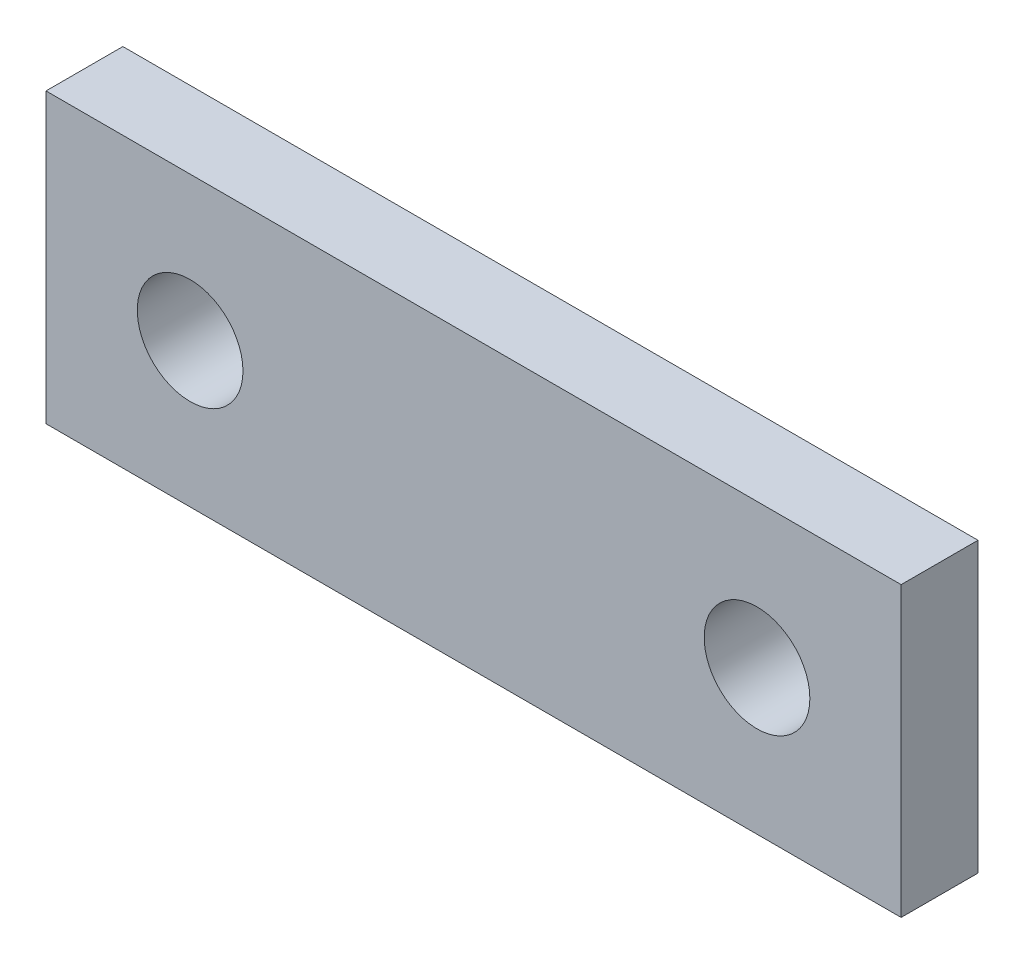
ISO-10303-21;
HEADER;
FILE_DESCRIPTION(('STEP AP214'),'2;1');
FILE_NAME('part.step','',(''),(''),'','','');
FILE_SCHEMA(('AUTOMOTIVE_DESIGN { 1 0 10303 214 1 1 1 1 }'));
ENDSEC;
DATA;
#1=APPLICATION_CONTEXT('core data for automotive mechanical design processes');
#2=APPLICATION_PROTOCOL_DEFINITION('international standard','automotive_design',2000,#1);
#3=PRODUCT_CONTEXT('',#1,'mechanical');
#4=PRODUCT('Part','Part','',(#3));
#5=PRODUCT_RELATED_PRODUCT_CATEGORY('part','',(#4));
#6=PRODUCT_DEFINITION_FORMATION('','',#4);
#7=PRODUCT_DEFINITION_CONTEXT('part definition',#1,'design');
#8=PRODUCT_DEFINITION('design','',#6,#7);
#9=PRODUCT_DEFINITION_SHAPE('','',#8);
#10=(LENGTH_UNIT() NAMED_UNIT(*) SI_UNIT(.MILLI.,.METRE.));
#11=(NAMED_UNIT(*) PLANE_ANGLE_UNIT() SI_UNIT($,.RADIAN.));
#12=(NAMED_UNIT(*) SI_UNIT($,.STERADIAN.) SOLID_ANGLE_UNIT());
#13=UNCERTAINTY_MEASURE_WITH_UNIT(LENGTH_MEASURE(1.E-05),#10,'distance_accuracy_value','');
#14=(GEOMETRIC_REPRESENTATION_CONTEXT(3) GLOBAL_UNCERTAINTY_ASSIGNED_CONTEXT((#13)) GLOBAL_UNIT_ASSIGNED_CONTEXT((#10,
#11,#12)) REPRESENTATION_CONTEXT('',''));
#15=CARTESIAN_POINT('',(0.,0.,0.));
#16=DIRECTION('',(0.,0.,1.));
#17=DIRECTION('',(1.,0.,0.));
#18=AXIS2_PLACEMENT_3D('',#15,#16,#17);
#19=CARTESIAN_POINT('',(0.,0.,16.));
#20=DIRECTION('',(1.,0.,0.));
#21=DIRECTION('',(0.,0.,-1.));
#22=AXIS2_PLACEMENT_3D('',#19,#20,#21);
#23=PLANE('',#22);
#24=DIRECTION('',(0.,-1.,0.));
#25=VECTOR('',#24,1.);
#26=CARTESIAN_POINT('',(0.,0.,0.));
#27=LINE('',#26,#25);
#28=CARTESIAN_POINT('',(0.,60.,0.));
#29=VERTEX_POINT('',#28);
#30=CARTESIAN_POINT('',(0.,0.,0.));
#31=VERTEX_POINT('',#30);
#32=EDGE_CURVE('E97',#29,#31,#27,.T.);
#33=ORIENTED_EDGE('',*,*,#32,.T.);
#34=DIRECTION('',(0.,0.,-1.));
#35=VECTOR('',#34,1.);
#36=CARTESIAN_POINT('',(0.,0.,16.));
#37=LINE('',#36,#35);
#38=CARTESIAN_POINT('',(0.,0.,16.));
#39=VERTEX_POINT('',#38);
#40=EDGE_CURVE('E11',#39,#31,#37,.T.);
#41=ORIENTED_EDGE('',*,*,#40,.F.);
#42=DIRECTION('',(0.,-1.,0.));
#43=VECTOR('',#42,1.);
#44=CARTESIAN_POINT('',(0.,0.,16.));
#45=LINE('',#44,#43);
#46=CARTESIAN_POINT('',(0.,60.,16.));
#47=VERTEX_POINT('',#46);
#48=EDGE_CURVE('E85',#47,#39,#45,.T.);
#49=ORIENTED_EDGE('',*,*,#48,.F.);
#50=DIRECTION('',(0.,0.,-1.));
#51=VECTOR('',#50,1.);
#52=CARTESIAN_POINT('',(0.,60.,16.));
#53=LINE('',#52,#51);
#54=EDGE_CURVE('E93',#47,#29,#53,.T.);
#55=ORIENTED_EDGE('',*,*,#54,.T.);
#56=EDGE_LOOP('',(#33,#41,#49,#55));
#57=FACE_BOUND('',#56,.T.);
#58=ADVANCED_FACE('F34',(#57),#23,.F.);
#59=CARTESIAN_POINT('',(0.,0.,16.));
#60=DIRECTION('',(0.,1.,0.));
#61=DIRECTION('',(0.,0.,1.));
#62=AXIS2_PLACEMENT_3D('',#59,#60,#61);
#63=PLANE('',#62);
#64=DIRECTION('',(1.,0.,0.));
#65=VECTOR('',#64,1.);
#66=CARTESIAN_POINT('',(0.,0.,0.));
#67=LINE('',#66,#65);
#68=CARTESIAN_POINT('',(178.,0.,0.));
#69=VERTEX_POINT('',#68);
#70=EDGE_CURVE('E89',#31,#69,#67,.T.);
#71=ORIENTED_EDGE('',*,*,#70,.T.);
#72=DIRECTION('',(0.,0.,-1.));
#73=VECTOR('',#72,1.);
#74=CARTESIAN_POINT('',(178.,0.,16.));
#75=LINE('',#74,#73);
#76=CARTESIAN_POINT('',(178.,0.,16.));
#77=VERTEX_POINT('',#76);
#78=EDGE_CURVE('E42',#77,#69,#75,.T.);
#79=ORIENTED_EDGE('',*,*,#78,.F.);
#80=DIRECTION('',(1.,0.,0.));
#81=VECTOR('',#80,1.);
#82=CARTESIAN_POINT('',(0.,0.,16.));
#83=LINE('',#82,#81);
#84=EDGE_CURVE('E80',#39,#77,#83,.T.);
#85=ORIENTED_EDGE('',*,*,#84,.F.);
#86=ORIENTED_EDGE('',*,*,#40,.T.);
#87=EDGE_LOOP('',(#71,#79,#85,#86));
#88=FACE_BOUND('',#87,.T.);
#89=ADVANCED_FACE('F88',(#88),#63,.F.);
#90=CARTESIAN_POINT('',(178.,0.,16.));
#91=DIRECTION('',(-1.,0.,0.));
#92=DIRECTION('',(0.,0.,1.));
#93=AXIS2_PLACEMENT_3D('',#90,#91,#92);
#94=PLANE('',#93);
#95=DIRECTION('',(0.,1.,0.));
#96=VECTOR('',#95,1.);
#97=CARTESIAN_POINT('',(178.,0.,0.));
#98=LINE('',#97,#96);
#99=CARTESIAN_POINT('',(178.,60.,0.));
#100=VERTEX_POINT('',#99);
#101=EDGE_CURVE('E67',#69,#100,#98,.T.);
#102=ORIENTED_EDGE('',*,*,#101,.T.);
#103=DIRECTION('',(0.,0.,-1.));
#104=VECTOR('',#103,1.);
#105=CARTESIAN_POINT('',(178.,60.,16.));
#106=LINE('',#105,#104);
#107=CARTESIAN_POINT('',(178.,60.,16.));
#108=VERTEX_POINT('',#107);
#109=EDGE_CURVE('E90',#108,#100,#106,.T.);
#110=ORIENTED_EDGE('',*,*,#109,.F.);
#111=DIRECTION('',(0.,1.,0.));
#112=VECTOR('',#111,1.);
#113=CARTESIAN_POINT('',(178.,0.,16.));
#114=LINE('',#113,#112);
#115=EDGE_CURVE('E83',#77,#108,#114,.T.);
#116=ORIENTED_EDGE('',*,*,#115,.F.);
#117=ORIENTED_EDGE('',*,*,#78,.T.);
#118=EDGE_LOOP('',(#102,#110,#116,#117));
#119=FACE_BOUND('',#118,.T.);
#120=ADVANCED_FACE('F91',(#119),#94,.F.);
#121=CARTESIAN_POINT('',(0.,60.,16.));
#122=DIRECTION('',(0.,-1.,0.));
#123=DIRECTION('',(0.,0.,-1.));
#124=AXIS2_PLACEMENT_3D('',#121,#122,#123);
#125=PLANE('',#124);
#126=DIRECTION('',(-1.,0.,0.));
#127=VECTOR('',#126,1.);
#128=CARTESIAN_POINT('',(0.,60.,0.));
#129=LINE('',#128,#127);
#130=EDGE_CURVE('E73',#100,#29,#129,.T.);
#131=ORIENTED_EDGE('',*,*,#130,.T.);
#132=ORIENTED_EDGE('',*,*,#54,.F.);
#133=DIRECTION('',(-1.,0.,0.));
#134=VECTOR('',#133,1.);
#135=CARTESIAN_POINT('',(0.,60.,16.));
#136=LINE('',#135,#134);
#137=EDGE_CURVE('E50',#108,#47,#136,.T.);
#138=ORIENTED_EDGE('',*,*,#137,.F.);
#139=ORIENTED_EDGE('',*,*,#109,.T.);
#140=EDGE_LOOP('',(#131,#132,#138,#139));
#141=FACE_BOUND('',#140,.T.);
#142=ADVANCED_FACE('F105',(#141),#125,.F.);
#143=CARTESIAN_POINT('',(0.,60.,16.));
#144=DIRECTION('',(0.,0.,-1.));
#145=DIRECTION('',(-1.,0.,0.));
#146=AXIS2_PLACEMENT_3D('',#143,#144,#145);
#147=PLANE('',#146);
#148=CARTESIAN_POINT('',(148.,30.,16.));
#149=DIRECTION('',(0.,0.,1.));
#150=DIRECTION('',(1.,0.,0.));
#151=AXIS2_PLACEMENT_3D('',#148,#149,#150);
#152=CIRCLE('',#151,11.);
#153=CARTESIAN_POINT('',(159.,30.,16.));
#154=VERTEX_POINT('',#153);
#155=EDGE_CURVE('E117',#154,#154,#152,.T.);
#156=ORIENTED_EDGE('',*,*,#155,.F.);
#157=EDGE_LOOP('',(#156));
#158=FACE_BOUND('',#157,.T.);
#159=CARTESIAN_POINT('',(30.,30.,16.));
#160=DIRECTION('',(0.,0.,1.));
#161=DIRECTION('',(1.,0.,0.));
#162=AXIS2_PLACEMENT_3D('',#159,#160,#161);
#163=CIRCLE('',#162,11.);
#164=CARTESIAN_POINT('',(41.,30.,16.));
#165=VERTEX_POINT('',#164);
#166=EDGE_CURVE('E111',#165,#165,#163,.T.);
#167=ORIENTED_EDGE('',*,*,#166,.F.);
#168=EDGE_LOOP('',(#167));
#169=FACE_BOUND('',#168,.T.);
#170=ORIENTED_EDGE('',*,*,#48,.T.);
#171=ORIENTED_EDGE('',*,*,#84,.T.);
#172=ORIENTED_EDGE('',*,*,#115,.T.);
#173=ORIENTED_EDGE('',*,*,#137,.T.);
#174=EDGE_LOOP('',(#170,#171,#172,#173));
#175=FACE_BOUND('',#174,.T.);
#176=ADVANCED_FACE('F81',(#158,#169,#175),#147,.F.);
#177=CARTESIAN_POINT('',(0.,60.,0.));
#178=DIRECTION('',(0.,0.,-1.));
#179=DIRECTION('',(-1.,0.,0.));
#180=AXIS2_PLACEMENT_3D('',#177,#178,#179);
#181=PLANE('',#180);
#182=CARTESIAN_POINT('',(148.,30.,0.));
#183=DIRECTION('',(0.,0.,1.));
#184=DIRECTION('',(1.,0.,0.));
#185=AXIS2_PLACEMENT_3D('',#182,#183,#184);
#186=CIRCLE('',#185,11.);
#187=CARTESIAN_POINT('',(159.,30.,0.));
#188=VERTEX_POINT('',#187);
#189=EDGE_CURVE('E114',#188,#188,#186,.T.);
#190=ORIENTED_EDGE('',*,*,#189,.T.);
#191=EDGE_LOOP('',(#190));
#192=FACE_BOUND('',#191,.T.);
#193=CARTESIAN_POINT('',(30.,30.,0.));
#194=DIRECTION('',(0.,0.,1.));
#195=DIRECTION('',(1.,0.,0.));
#196=AXIS2_PLACEMENT_3D('',#193,#194,#195);
#197=CIRCLE('',#196,11.);
#198=CARTESIAN_POINT('',(41.,30.,0.));
#199=VERTEX_POINT('',#198);
#200=EDGE_CURVE('E100',#199,#199,#197,.T.);
#201=ORIENTED_EDGE('',*,*,#200,.T.);
#202=EDGE_LOOP('',(#201));
#203=FACE_BOUND('',#202,.T.);
#204=ORIENTED_EDGE('',*,*,#32,.F.);
#205=ORIENTED_EDGE('',*,*,#130,.F.);
#206=ORIENTED_EDGE('',*,*,#101,.F.);
#207=ORIENTED_EDGE('',*,*,#70,.F.);
#208=EDGE_LOOP('',(#204,#205,#206,#207));
#209=FACE_BOUND('',#208,.T.);
#210=ADVANCED_FACE('F108',(#192,#203,#209),#181,.T.);
#211=CARTESIAN_POINT('',(30.,30.,0.));
#212=DIRECTION('',(0.,0.,1.));
#213=DIRECTION('',(1.,0.,0.));
#214=AXIS2_PLACEMENT_3D('',#211,#212,#213);
#215=CYLINDRICAL_SURFACE('',#214,11.);
#216=ORIENTED_EDGE('',*,*,#200,.F.);
#217=EDGE_LOOP('',(#216));
#218=FACE_BOUND('',#217,.T.);
#219=ORIENTED_EDGE('',*,*,#166,.T.);
#220=EDGE_LOOP('',(#219));
#221=FACE_BOUND('',#220,.T.);
#222=ADVANCED_FACE('F128',(#218,#221),#215,.F.);
#223=CARTESIAN_POINT('',(148.,30.,0.));
#224=DIRECTION('',(0.,0.,1.));
#225=DIRECTION('',(1.,0.,0.));
#226=AXIS2_PLACEMENT_3D('',#223,#224,#225);
#227=CYLINDRICAL_SURFACE('',#226,11.);
#228=ORIENTED_EDGE('',*,*,#189,.F.);
#229=EDGE_LOOP('',(#228));
#230=FACE_BOUND('',#229,.T.);
#231=ORIENTED_EDGE('',*,*,#155,.T.);
#232=EDGE_LOOP('',(#231));
#233=FACE_BOUND('',#232,.T.);
#234=ADVANCED_FACE('F125',(#230,#233),#227,.F.);
#235=CLOSED_SHELL('',(#58,#89,#120,#142,#176,#210,#222,#234));
#236=MANIFOLD_SOLID_BREP('B2',#235);
#237=ADVANCED_BREP_SHAPE_REPRESENTATION('',(#18,#236),#14);
#238=SHAPE_DEFINITION_REPRESENTATION(#9,#237);
ENDSEC;
END-ISO-10303-21;
